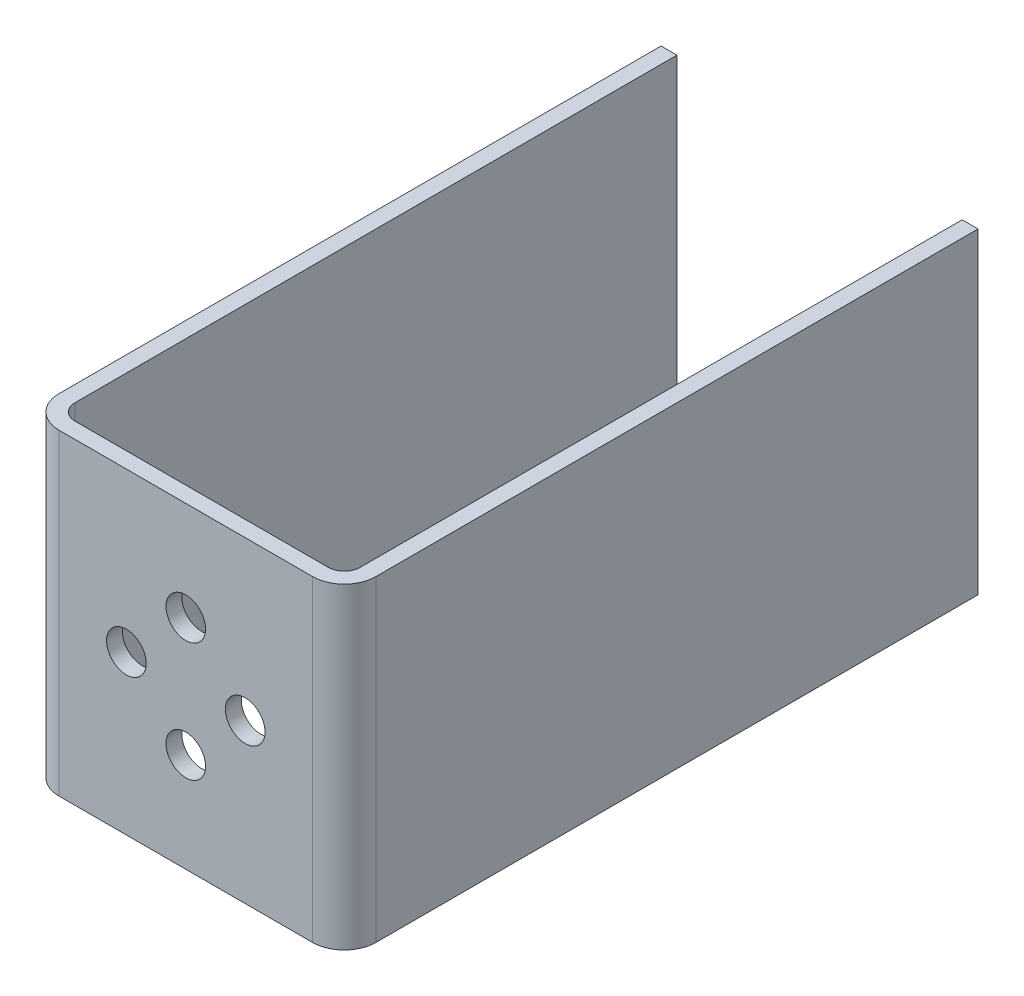
ISO-10303-21;
HEADER;
FILE_DESCRIPTION(('STEP AP214'),'2;1');
FILE_NAME('part.step','',(''),(''),'','','');
FILE_SCHEMA(('AUTOMOTIVE_DESIGN { 1 0 10303 214 1 1 1 1 }'));
ENDSEC;
DATA;
#1=APPLICATION_CONTEXT('core data for automotive mechanical design processes');
#2=APPLICATION_PROTOCOL_DEFINITION('international standard','automotive_design',2000,#1);
#3=PRODUCT_CONTEXT('',#1,'mechanical');
#4=PRODUCT('Part','Part','',(#3));
#5=PRODUCT_RELATED_PRODUCT_CATEGORY('part','',(#4));
#6=PRODUCT_DEFINITION_FORMATION('','',#4);
#7=PRODUCT_DEFINITION_CONTEXT('part definition',#1,'design');
#8=PRODUCT_DEFINITION('design','',#6,#7);
#9=PRODUCT_DEFINITION_SHAPE('','',#8);
#10=(LENGTH_UNIT() NAMED_UNIT(*) SI_UNIT(.MILLI.,.METRE.));
#11=(NAMED_UNIT(*) PLANE_ANGLE_UNIT() SI_UNIT($,.RADIAN.));
#12=(NAMED_UNIT(*) SI_UNIT($,.STERADIAN.) SOLID_ANGLE_UNIT());
#13=UNCERTAINTY_MEASURE_WITH_UNIT(LENGTH_MEASURE(1.E-05),#10,'distance_accuracy_value','');
#14=(GEOMETRIC_REPRESENTATION_CONTEXT(3) GLOBAL_UNCERTAINTY_ASSIGNED_CONTEXT((#13)) GLOBAL_UNIT_ASSIGNED_CONTEXT((#10,
#11,#12)) REPRESENTATION_CONTEXT('',''));
#15=CARTESIAN_POINT('',(0.,0.,0.));
#16=DIRECTION('',(0.,0.,1.));
#17=DIRECTION('',(1.,0.,0.));
#18=AXIS2_PLACEMENT_3D('',#15,#16,#17);
#19=CARTESIAN_POINT('',(48.26,50.8,-101.6));
#20=DIRECTION('',(0.,0.,1.));
#21=DIRECTION('',(1.,0.,0.));
#22=AXIS2_PLACEMENT_3D('',#19,#20,#21);
#23=PLANE('',#22);
#24=DIRECTION('',(-1.,0.,0.));
#25=VECTOR('',#24,1.);
#26=CARTESIAN_POINT('',(48.26,0.,-101.6));
#27=LINE('',#26,#25);
#28=CARTESIAN_POINT('',(50.8,0.,-101.6));
#29=VERTEX_POINT('',#28);
#30=CARTESIAN_POINT('',(48.26,0.,-101.6));
#31=VERTEX_POINT('',#30);
#32=EDGE_CURVE('E158',#29,#31,#27,.T.);
#33=ORIENTED_EDGE('',*,*,#32,.T.);
#34=DIRECTION('',(0.,-1.,0.));
#35=VECTOR('',#34,1.);
#36=CARTESIAN_POINT('',(48.26,50.8,-101.6));
#37=LINE('',#36,#35);
#38=CARTESIAN_POINT('',(48.26,50.8,-101.6));
#39=VERTEX_POINT('',#38);
#40=EDGE_CURVE('E11',#39,#31,#37,.T.);
#41=ORIENTED_EDGE('',*,*,#40,.F.);
#42=DIRECTION('',(-1.,0.,0.));
#43=VECTOR('',#42,1.);
#44=CARTESIAN_POINT('',(48.26,50.8,-101.6));
#45=LINE('',#44,#43);
#46=CARTESIAN_POINT('',(50.8,50.8,-101.6));
#47=VERTEX_POINT('',#46);
#48=EDGE_CURVE('E181',#47,#39,#45,.T.);
#49=ORIENTED_EDGE('',*,*,#48,.F.);
#50=DIRECTION('',(0.,-1.,0.));
#51=VECTOR('',#50,1.);
#52=CARTESIAN_POINT('',(50.8,50.8,-101.6));
#53=LINE('',#52,#51);
#54=EDGE_CURVE('E154',#47,#29,#53,.T.);
#55=ORIENTED_EDGE('',*,*,#54,.T.);
#56=EDGE_LOOP('',(#33,#41,#49,#55));
#57=FACE_BOUND('',#56,.T.);
#58=ADVANCED_FACE('F38',(#57),#23,.F.);
#59=CARTESIAN_POINT('',(48.26,50.8,-5.08));
#60=DIRECTION('',(1.,0.,0.));
#61=DIRECTION('',(0.,0.,-1.));
#62=AXIS2_PLACEMENT_3D('',#59,#60,#61);
#63=PLANE('',#62);
#64=DIRECTION('',(0.,0.,1.));
#65=VECTOR('',#64,1.);
#66=CARTESIAN_POINT('',(48.26,0.,-5.08));
#67=LINE('',#66,#65);
#68=CARTESIAN_POINT('',(48.26,0.,-5.08));
#69=VERTEX_POINT('',#68);
#70=EDGE_CURVE('E161',#31,#69,#67,.T.);
#71=ORIENTED_EDGE('',*,*,#70,.T.);
#72=DIRECTION('',(0.,-1.,0.));
#73=VECTOR('',#72,1.);
#74=CARTESIAN_POINT('',(48.26,50.8,-5.08));
#75=LINE('',#74,#73);
#76=CARTESIAN_POINT('',(48.26,50.8,-5.08));
#77=VERTEX_POINT('',#76);
#78=EDGE_CURVE('E46',#77,#69,#75,.T.);
#79=ORIENTED_EDGE('',*,*,#78,.F.);
#80=DIRECTION('',(0.,0.,1.));
#81=VECTOR('',#80,1.);
#82=CARTESIAN_POINT('',(48.26,50.8,-5.08));
#83=LINE('',#82,#81);
#84=EDGE_CURVE('E109',#39,#77,#83,.T.);
#85=ORIENTED_EDGE('',*,*,#84,.F.);
#86=ORIENTED_EDGE('',*,*,#40,.T.);
#87=EDGE_LOOP('',(#71,#79,#85,#86));
#88=FACE_BOUND('',#87,.T.);
#89=ADVANCED_FACE('F259',(#88),#63,.F.);
#90=CARTESIAN_POINT('',(45.72,50.8,-5.08));
#91=DIRECTION('',(0.,-1.,0.));
#92=DIRECTION('',(0.,0.,-1.));
#93=AXIS2_PLACEMENT_3D('',#90,#91,#92);
#94=CYLINDRICAL_SURFACE('',#93,2.54);
#95=CARTESIAN_POINT('',(45.72,0.,-5.08));
#96=DIRECTION('',(0.,-1.,0.));
#97=DIRECTION('',(0.,0.,1.));
#98=AXIS2_PLACEMENT_3D('',#95,#96,#97);
#99=CIRCLE('',#98,2.54);
#100=CARTESIAN_POINT('',(45.72,0.,-2.54));
#101=VERTEX_POINT('',#100);
#102=EDGE_CURVE('E164',#69,#101,#99,.T.);
#103=ORIENTED_EDGE('',*,*,#102,.T.);
#104=DIRECTION('',(0.,-1.,0.));
#105=VECTOR('',#104,1.);
#106=CARTESIAN_POINT('',(45.72,50.8,-2.54));
#107=LINE('',#106,#105);
#108=CARTESIAN_POINT('',(45.72,50.8,-2.54));
#109=VERTEX_POINT('',#108);
#110=EDGE_CURVE('E200',#109,#101,#107,.T.);
#111=ORIENTED_EDGE('',*,*,#110,.F.);
#112=CARTESIAN_POINT('',(45.72,50.8,-5.08));
#113=DIRECTION('',(0.,-1.,0.));
#114=DIRECTION('',(0.,0.,1.));
#115=AXIS2_PLACEMENT_3D('',#112,#113,#114);
#116=CIRCLE('',#115,2.54);
#117=EDGE_CURVE('E208',#77,#109,#116,.T.);
#118=ORIENTED_EDGE('',*,*,#117,.F.);
#119=ORIENTED_EDGE('',*,*,#78,.T.);
#120=EDGE_LOOP('',(#103,#111,#118,#119));
#121=FACE_BOUND('',#120,.T.);
#122=ADVANCED_FACE('F206',(#121),#94,.F.);
#123=CARTESIAN_POINT('',(5.08000000000001,50.8,-2.54));
#124=DIRECTION('',(0.,0.,1.));
#125=DIRECTION('',(1.,0.,0.));
#126=AXIS2_PLACEMENT_3D('',#123,#124,#125);
#127=PLANE('',#126);
#128=CARTESIAN_POINT('',(34.925,25.4,-2.54));
#129=DIRECTION('',(0.,0.,-1.));
#130=DIRECTION('',(-1.,0.,0.));
#131=AXIS2_PLACEMENT_3D('',#128,#129,#130);
#132=CIRCLE('',#131,3.175);
#133=CARTESIAN_POINT('',(31.75,25.4,-2.54));
#134=VERTEX_POINT('',#133);
#135=EDGE_CURVE('E319',#134,#134,#132,.T.);
#136=ORIENTED_EDGE('',*,*,#135,.F.);
#137=EDGE_LOOP('',(#136));
#138=FACE_BOUND('',#137,.T.);
#139=CARTESIAN_POINT('',(25.4,34.925,-2.54));
#140=DIRECTION('',(0.,0.,-1.));
#141=DIRECTION('',(-1.,0.,0.));
#142=AXIS2_PLACEMENT_3D('',#139,#140,#141);
#143=CIRCLE('',#142,3.175);
#144=CARTESIAN_POINT('',(22.225,34.925,-2.54));
#145=VERTEX_POINT('',#144);
#146=EDGE_CURVE('E316',#145,#145,#143,.T.);
#147=ORIENTED_EDGE('',*,*,#146,.F.);
#148=EDGE_LOOP('',(#147));
#149=FACE_BOUND('',#148,.T.);
#150=CARTESIAN_POINT('',(15.875,25.4,-2.54));
#151=DIRECTION('',(0.,0.,-1.));
#152=DIRECTION('',(-1.,0.,0.));
#153=AXIS2_PLACEMENT_3D('',#150,#151,#152);
#154=CIRCLE('',#153,3.17499999999999);
#155=CARTESIAN_POINT('',(12.7,25.4,-2.54));
#156=VERTEX_POINT('',#155);
#157=EDGE_CURVE('E312',#156,#156,#154,.T.);
#158=ORIENTED_EDGE('',*,*,#157,.F.);
#159=EDGE_LOOP('',(#158));
#160=FACE_BOUND('',#159,.T.);
#161=CARTESIAN_POINT('',(25.4,15.875,-2.54));
#162=DIRECTION('',(0.,0.,-1.));
#163=DIRECTION('',(-1.,0.,0.));
#164=AXIS2_PLACEMENT_3D('',#161,#162,#163);
#165=CIRCLE('',#164,3.175);
#166=CARTESIAN_POINT('',(22.225,15.875,-2.54));
#167=VERTEX_POINT('',#166);
#168=EDGE_CURVE('E304',#167,#167,#165,.T.);
#169=ORIENTED_EDGE('',*,*,#168,.F.);
#170=EDGE_LOOP('',(#169));
#171=FACE_BOUND('',#170,.T.);
#172=DIRECTION('',(-1.,0.,0.));
#173=VECTOR('',#172,1.);
#174=CARTESIAN_POINT('',(5.08000000000001,0.,-2.54));
#175=LINE('',#174,#173);
#176=CARTESIAN_POINT('',(5.08000000000001,0.,-2.54));
#177=VERTEX_POINT('',#176);
#178=EDGE_CURVE('E166',#101,#177,#175,.T.);
#179=ORIENTED_EDGE('',*,*,#178,.T.);
#180=DIRECTION('',(0.,-1.,0.));
#181=VECTOR('',#180,1.);
#182=CARTESIAN_POINT('',(5.08000000000001,50.8,-2.54));
#183=LINE('',#182,#181);
#184=CARTESIAN_POINT('',(5.08000000000001,50.8,-2.54));
#185=VERTEX_POINT('',#184);
#186=EDGE_CURVE('E197',#185,#177,#183,.T.);
#187=ORIENTED_EDGE('',*,*,#186,.F.);
#188=DIRECTION('',(-1.,0.,0.));
#189=VECTOR('',#188,1.);
#190=CARTESIAN_POINT('',(5.08000000000001,50.8,-2.54));
#191=LINE('',#190,#189);
#192=EDGE_CURVE('E226',#109,#185,#191,.T.);
#193=ORIENTED_EDGE('',*,*,#192,.F.);
#194=ORIENTED_EDGE('',*,*,#110,.T.);
#195=EDGE_LOOP('',(#179,#187,#193,#194));
#196=FACE_BOUND('',#195,.T.);
#197=ADVANCED_FACE('F217',(#138,#149,#160,#171,#196),#127,.F.);
#198=CARTESIAN_POINT('',(5.08000000000001,50.8,-5.08));
#199=DIRECTION('',(0.,-1.,0.));
#200=DIRECTION('',(0.,0.,-1.));
#201=AXIS2_PLACEMENT_3D('',#198,#199,#200);
#202=CYLINDRICAL_SURFACE('',#201,2.54);
#203=CARTESIAN_POINT('',(5.08000000000001,0.,-5.08));
#204=DIRECTION('',(0.,-1.,0.));
#205=DIRECTION('',(0.,0.,1.));
#206=AXIS2_PLACEMENT_3D('',#203,#204,#205);
#207=CIRCLE('',#206,2.54);
#208=CARTESIAN_POINT('',(2.54000000000001,0.,-5.08));
#209=VERTEX_POINT('',#208);
#210=EDGE_CURVE('E168',#177,#209,#207,.T.);
#211=ORIENTED_EDGE('',*,*,#210,.T.);
#212=DIRECTION('',(0.,-1.,0.));
#213=VECTOR('',#212,1.);
#214=CARTESIAN_POINT('',(2.54000000000001,50.8,-5.08));
#215=LINE('',#214,#213);
#216=CARTESIAN_POINT('',(2.54000000000001,50.8,-5.08));
#217=VERTEX_POINT('',#216);
#218=EDGE_CURVE('E194',#217,#209,#215,.T.);
#219=ORIENTED_EDGE('',*,*,#218,.F.);
#220=CARTESIAN_POINT('',(5.08000000000001,50.8,-5.08));
#221=DIRECTION('',(0.,-1.,0.));
#222=DIRECTION('',(0.,0.,1.));
#223=AXIS2_PLACEMENT_3D('',#220,#221,#222);
#224=CIRCLE('',#223,2.54);
#225=EDGE_CURVE('E223',#185,#217,#224,.T.);
#226=ORIENTED_EDGE('',*,*,#225,.F.);
#227=ORIENTED_EDGE('',*,*,#186,.T.);
#228=EDGE_LOOP('',(#211,#219,#226,#227));
#229=FACE_BOUND('',#228,.T.);
#230=ADVANCED_FACE('F221',(#229),#202,.F.);
#231=CARTESIAN_POINT('',(2.54,50.8,-101.6));
#232=DIRECTION('',(-1.,0.,0.));
#233=DIRECTION('',(0.,0.,1.));
#234=AXIS2_PLACEMENT_3D('',#231,#232,#233);
#235=PLANE('',#234);
#236=DIRECTION('',(0.,0.,-1.));
#237=VECTOR('',#236,1.);
#238=CARTESIAN_POINT('',(2.54,0.,-101.6));
#239=LINE('',#238,#237);
#240=CARTESIAN_POINT('',(2.54,0.,-101.6));
#241=VERTEX_POINT('',#240);
#242=EDGE_CURVE('E170',#209,#241,#239,.T.);
#243=ORIENTED_EDGE('',*,*,#242,.T.);
#244=DIRECTION('',(0.,-1.,0.));
#245=VECTOR('',#244,1.);
#246=CARTESIAN_POINT('',(2.54,50.8,-101.6));
#247=LINE('',#246,#245);
#248=CARTESIAN_POINT('',(2.54,50.8,-101.6));
#249=VERTEX_POINT('',#248);
#250=EDGE_CURVE('E191',#249,#241,#247,.T.);
#251=ORIENTED_EDGE('',*,*,#250,.F.);
#252=DIRECTION('',(0.,0.,-1.));
#253=VECTOR('',#252,1.);
#254=CARTESIAN_POINT('',(2.54,50.8,-101.6));
#255=LINE('',#254,#253);
#256=EDGE_CURVE('E225',#217,#249,#255,.T.);
#257=ORIENTED_EDGE('',*,*,#256,.F.);
#258=ORIENTED_EDGE('',*,*,#218,.T.);
#259=EDGE_LOOP('',(#243,#251,#257,#258));
#260=FACE_BOUND('',#259,.T.);
#261=ADVANCED_FACE('F273',(#260),#235,.F.);
#262=CARTESIAN_POINT('',(0.,50.8,-101.6));
#263=DIRECTION('',(0.,0.,1.));
#264=DIRECTION('',(1.,0.,0.));
#265=AXIS2_PLACEMENT_3D('',#262,#263,#264);
#266=PLANE('',#265);
#267=DIRECTION('',(-1.,0.,0.));
#268=VECTOR('',#267,1.);
#269=CARTESIAN_POINT('',(0.,0.,-101.6));
#270=LINE('',#269,#268);
#271=CARTESIAN_POINT('',(0.,0.,-101.6));
#272=VERTEX_POINT('',#271);
#273=EDGE_CURVE('E172',#241,#272,#270,.T.);
#274=ORIENTED_EDGE('',*,*,#273,.T.);
#275=DIRECTION('',(0.,-1.,0.));
#276=VECTOR('',#275,1.);
#277=CARTESIAN_POINT('',(0.,50.8,-101.6));
#278=LINE('',#277,#276);
#279=CARTESIAN_POINT('',(0.,50.8,-101.6));
#280=VERTEX_POINT('',#279);
#281=EDGE_CURVE('E188',#280,#272,#278,.T.);
#282=ORIENTED_EDGE('',*,*,#281,.F.);
#283=DIRECTION('',(-1.,0.,0.));
#284=VECTOR('',#283,1.);
#285=CARTESIAN_POINT('',(0.,50.8,-101.6));
#286=LINE('',#285,#284);
#287=EDGE_CURVE('E228',#249,#280,#286,.T.);
#288=ORIENTED_EDGE('',*,*,#287,.F.);
#289=ORIENTED_EDGE('',*,*,#250,.T.);
#290=EDGE_LOOP('',(#274,#282,#288,#289));
#291=FACE_BOUND('',#290,.T.);
#292=ADVANCED_FACE('F276',(#291),#266,.F.);
#293=CARTESIAN_POINT('',(0.,50.8,-5.08000000000004));
#294=DIRECTION('',(1.,0.,0.));
#295=DIRECTION('',(0.,0.,-1.));
#296=AXIS2_PLACEMENT_3D('',#293,#294,#295);
#297=PLANE('',#296);
#298=DIRECTION('',(0.,0.,1.));
#299=VECTOR('',#298,1.);
#300=CARTESIAN_POINT('',(0.,0.,-5.08000000000004));
#301=LINE('',#300,#299);
#302=CARTESIAN_POINT('',(0.,0.,-5.08000000000003));
#303=VERTEX_POINT('',#302);
#304=EDGE_CURVE('E174',#272,#303,#301,.T.);
#305=ORIENTED_EDGE('',*,*,#304,.T.);
#306=DIRECTION('',(0.,-1.,0.));
#307=VECTOR('',#306,1.);
#308=CARTESIAN_POINT('',(0.,50.8,-5.08000000000003));
#309=LINE('',#308,#307);
#310=CARTESIAN_POINT('',(0.,50.8,-5.08000000000003));
#311=VERTEX_POINT('',#310);
#312=EDGE_CURVE('E185',#311,#303,#309,.T.);
#313=ORIENTED_EDGE('',*,*,#312,.F.);
#314=DIRECTION('',(0.,0.,1.));
#315=VECTOR('',#314,1.);
#316=CARTESIAN_POINT('',(0.,50.8,-5.08000000000004));
#317=LINE('',#316,#315);
#318=EDGE_CURVE('E234',#280,#311,#317,.T.);
#319=ORIENTED_EDGE('',*,*,#318,.F.);
#320=ORIENTED_EDGE('',*,*,#281,.T.);
#321=EDGE_LOOP('',(#305,#313,#319,#320));
#322=FACE_BOUND('',#321,.T.);
#323=ADVANCED_FACE('F240',(#322),#297,.F.);
#324=CARTESIAN_POINT('',(5.08,50.8,-5.08));
#325=DIRECTION('',(0.,-1.,0.));
#326=DIRECTION('',(0.,0.,-1.));
#327=AXIS2_PLACEMENT_3D('',#324,#325,#326);
#328=CYLINDRICAL_SURFACE('',#327,5.08);
#329=CARTESIAN_POINT('',(5.08,0.,-5.08));
#330=DIRECTION('',(0.,1.,0.));
#331=DIRECTION('',(0.,0.,-1.));
#332=AXIS2_PLACEMENT_3D('',#329,#330,#331);
#333=CIRCLE('',#332,5.08);
#334=CARTESIAN_POINT('',(5.08000000000004,0.,0.));
#335=VERTEX_POINT('',#334);
#336=EDGE_CURVE('E176',#303,#335,#333,.T.);
#337=ORIENTED_EDGE('',*,*,#336,.T.);
#338=DIRECTION('',(0.,-1.,0.));
#339=VECTOR('',#338,1.);
#340=CARTESIAN_POINT('',(5.08000000000004,50.8,0.));
#341=LINE('',#340,#339);
#342=CARTESIAN_POINT('',(5.08000000000004,50.8,0.));
#343=VERTEX_POINT('',#342);
#344=EDGE_CURVE('E149',#343,#335,#341,.T.);
#345=ORIENTED_EDGE('',*,*,#344,.F.);
#346=CARTESIAN_POINT('',(5.08,50.8,-5.08));
#347=DIRECTION('',(0.,1.,0.));
#348=DIRECTION('',(0.,0.,-1.));
#349=AXIS2_PLACEMENT_3D('',#346,#347,#348);
#350=CIRCLE('',#349,5.08);
#351=EDGE_CURVE('E140',#311,#343,#350,.T.);
#352=ORIENTED_EDGE('',*,*,#351,.F.);
#353=ORIENTED_EDGE('',*,*,#312,.T.);
#354=EDGE_LOOP('',(#337,#345,#352,#353));
#355=FACE_BOUND('',#354,.T.);
#356=ADVANCED_FACE('F244',(#355),#328,.T.);
#357=CARTESIAN_POINT('',(5.08000000000004,50.8,0.));
#358=DIRECTION('',(0.,0.,-1.));
#359=DIRECTION('',(-1.,0.,0.));
#360=AXIS2_PLACEMENT_3D('',#357,#358,#359);
#361=PLANE('',#360);
#362=CARTESIAN_POINT('',(34.925,25.4,0.));
#363=DIRECTION('',(0.,0.,-1.));
#364=DIRECTION('',(-1.,0.,0.));
#365=AXIS2_PLACEMENT_3D('',#362,#363,#364);
#366=CIRCLE('',#365,3.175);
#367=CARTESIAN_POINT('',(31.75,25.4,0.));
#368=VERTEX_POINT('',#367);
#369=EDGE_CURVE('E162',#368,#368,#366,.T.);
#370=ORIENTED_EDGE('',*,*,#369,.T.);
#371=EDGE_LOOP('',(#370));
#372=FACE_BOUND('',#371,.T.);
#373=CARTESIAN_POINT('',(25.4,34.925,0.));
#374=DIRECTION('',(0.,0.,-1.));
#375=DIRECTION('',(-1.,0.,0.));
#376=AXIS2_PLACEMENT_3D('',#373,#374,#375);
#377=CIRCLE('',#376,3.175);
#378=CARTESIAN_POINT('',(22.225,34.925,0.));
#379=VERTEX_POINT('',#378);
#380=EDGE_CURVE('E295',#379,#379,#377,.T.);
#381=ORIENTED_EDGE('',*,*,#380,.T.);
#382=EDGE_LOOP('',(#381));
#383=FACE_BOUND('',#382,.T.);
#384=CARTESIAN_POINT('',(15.875,25.4,0.));
#385=DIRECTION('',(0.,0.,-1.));
#386=DIRECTION('',(-1.,0.,0.));
#387=AXIS2_PLACEMENT_3D('',#384,#385,#386);
#388=CIRCLE('',#387,3.17499999999999);
#389=CARTESIAN_POINT('',(12.7,25.4,0.));
#390=VERTEX_POINT('',#389);
#391=EDGE_CURVE('E299',#390,#390,#388,.T.);
#392=ORIENTED_EDGE('',*,*,#391,.T.);
#393=EDGE_LOOP('',(#392));
#394=FACE_BOUND('',#393,.T.);
#395=CARTESIAN_POINT('',(25.4,15.875,0.));
#396=DIRECTION('',(0.,0.,-1.));
#397=DIRECTION('',(-1.,0.,0.));
#398=AXIS2_PLACEMENT_3D('',#395,#396,#397);
#399=CIRCLE('',#398,3.175);
#400=CARTESIAN_POINT('',(22.225,15.875,0.));
#401=VERTEX_POINT('',#400);
#402=EDGE_CURVE('E302',#401,#401,#399,.T.);
#403=ORIENTED_EDGE('',*,*,#402,.T.);
#404=EDGE_LOOP('',(#403));
#405=FACE_BOUND('',#404,.T.);
#406=DIRECTION('',(1.,0.,0.));
#407=VECTOR('',#406,1.);
#408=CARTESIAN_POINT('',(5.08000000000004,0.,0.));
#409=LINE('',#408,#407);
#410=CARTESIAN_POINT('',(45.72,0.,0.));
#411=VERTEX_POINT('',#410);
#412=EDGE_CURVE('E148',#335,#411,#409,.T.);
#413=ORIENTED_EDGE('',*,*,#412,.T.);
#414=DIRECTION('',(0.,-1.,0.));
#415=VECTOR('',#414,1.);
#416=CARTESIAN_POINT('',(45.72,50.8,0.));
#417=LINE('',#416,#415);
#418=CARTESIAN_POINT('',(45.72,50.8,0.));
#419=VERTEX_POINT('',#418);
#420=EDGE_CURVE('E145',#419,#411,#417,.T.);
#421=ORIENTED_EDGE('',*,*,#420,.F.);
#422=DIRECTION('',(1.,0.,0.));
#423=VECTOR('',#422,1.);
#424=CARTESIAN_POINT('',(5.08000000000004,50.8,0.));
#425=LINE('',#424,#423);
#426=EDGE_CURVE('E134',#343,#419,#425,.T.);
#427=ORIENTED_EDGE('',*,*,#426,.F.);
#428=ORIENTED_EDGE('',*,*,#344,.T.);
#429=EDGE_LOOP('',(#413,#421,#427,#428));
#430=FACE_BOUND('',#429,.T.);
#431=ADVANCED_FACE('F146',(#372,#383,#394,#405,#430),#361,.F.);
#432=CARTESIAN_POINT('',(45.72,50.8,-5.08));
#433=DIRECTION('',(0.,-1.,0.));
#434=DIRECTION('',(0.,0.,-1.));
#435=AXIS2_PLACEMENT_3D('',#432,#433,#434);
#436=CYLINDRICAL_SURFACE('',#435,5.08);
#437=CARTESIAN_POINT('',(45.72,0.,-5.08));
#438=DIRECTION('',(0.,1.,0.));
#439=DIRECTION('',(0.,0.,1.));
#440=AXIS2_PLACEMENT_3D('',#437,#438,#439);
#441=CIRCLE('',#440,5.08);
#442=CARTESIAN_POINT('',(50.8,0.,-5.08));
#443=VERTEX_POINT('',#442);
#444=EDGE_CURVE('E95',#411,#443,#441,.T.);
#445=ORIENTED_EDGE('',*,*,#444,.T.);
#446=DIRECTION('',(0.,-1.,0.));
#447=VECTOR('',#446,1.);
#448=CARTESIAN_POINT('',(50.8,50.8,-5.08));
#449=LINE('',#448,#447);
#450=CARTESIAN_POINT('',(50.8,50.8,-5.08));
#451=VERTEX_POINT('',#450);
#452=EDGE_CURVE('E150',#451,#443,#449,.T.);
#453=ORIENTED_EDGE('',*,*,#452,.F.);
#454=CARTESIAN_POINT('',(45.72,50.8,-5.08));
#455=DIRECTION('',(0.,1.,0.));
#456=DIRECTION('',(0.,0.,1.));
#457=AXIS2_PLACEMENT_3D('',#454,#455,#456);
#458=CIRCLE('',#457,5.08);
#459=EDGE_CURVE('E138',#419,#451,#458,.T.);
#460=ORIENTED_EDGE('',*,*,#459,.F.);
#461=ORIENTED_EDGE('',*,*,#420,.T.);
#462=EDGE_LOOP('',(#445,#453,#460,#461));
#463=FACE_BOUND('',#462,.T.);
#464=ADVANCED_FACE('F152',(#463),#436,.T.);
#465=CARTESIAN_POINT('',(50.8,50.8,-5.08));
#466=DIRECTION('',(-1.,0.,0.));
#467=DIRECTION('',(0.,0.,1.));
#468=AXIS2_PLACEMENT_3D('',#465,#466,#467);
#469=PLANE('',#468);
#470=DIRECTION('',(0.,0.,-1.));
#471=VECTOR('',#470,1.);
#472=CARTESIAN_POINT('',(50.8,0.,-5.08));
#473=LINE('',#472,#471);
#474=EDGE_CURVE('E101',#443,#29,#473,.T.);
#475=ORIENTED_EDGE('',*,*,#474,.T.);
#476=ORIENTED_EDGE('',*,*,#54,.F.);
#477=DIRECTION('',(0.,0.,-1.));
#478=VECTOR('',#477,1.);
#479=CARTESIAN_POINT('',(50.8,50.8,-5.08));
#480=LINE('',#479,#478);
#481=EDGE_CURVE('E54',#451,#47,#480,.T.);
#482=ORIENTED_EDGE('',*,*,#481,.F.);
#483=ORIENTED_EDGE('',*,*,#452,.T.);
#484=EDGE_LOOP('',(#475,#476,#482,#483));
#485=FACE_BOUND('',#484,.T.);
#486=ADVANCED_FACE('F248',(#485),#469,.F.);
#487=CARTESIAN_POINT('',(45.72,50.8,-5.08));
#488=DIRECTION('',(0.,1.,0.));
#489=DIRECTION('',(0.,0.,1.));
#490=AXIS2_PLACEMENT_3D('',#487,#488,#489);
#491=PLANE('',#490);
#492=ORIENTED_EDGE('',*,*,#48,.T.);
#493=ORIENTED_EDGE('',*,*,#84,.T.);
#494=ORIENTED_EDGE('',*,*,#117,.T.);
#495=ORIENTED_EDGE('',*,*,#192,.T.);
#496=ORIENTED_EDGE('',*,*,#225,.T.);
#497=ORIENTED_EDGE('',*,*,#256,.T.);
#498=ORIENTED_EDGE('',*,*,#287,.T.);
#499=ORIENTED_EDGE('',*,*,#318,.T.);
#500=ORIENTED_EDGE('',*,*,#351,.T.);
#501=ORIENTED_EDGE('',*,*,#426,.T.);
#502=ORIENTED_EDGE('',*,*,#459,.T.);
#503=ORIENTED_EDGE('',*,*,#481,.T.);
#504=EDGE_LOOP('',(#492,#493,#494,#495,#496,#497,#498,#499,#500,#501,#502,#503));
#505=FACE_BOUND('',#504,.T.);
#506=ADVANCED_FACE('F136',(#505),#491,.T.);
#507=CARTESIAN_POINT('',(45.72,0.,-5.08));
#508=DIRECTION('',(0.,1.,0.));
#509=DIRECTION('',(0.,0.,1.));
#510=AXIS2_PLACEMENT_3D('',#507,#508,#509);
#511=PLANE('',#510);
#512=ORIENTED_EDGE('',*,*,#32,.F.);
#513=ORIENTED_EDGE('',*,*,#474,.F.);
#514=ORIENTED_EDGE('',*,*,#444,.F.);
#515=ORIENTED_EDGE('',*,*,#412,.F.);
#516=ORIENTED_EDGE('',*,*,#336,.F.);
#517=ORIENTED_EDGE('',*,*,#304,.F.);
#518=ORIENTED_EDGE('',*,*,#273,.F.);
#519=ORIENTED_EDGE('',*,*,#242,.F.);
#520=ORIENTED_EDGE('',*,*,#210,.F.);
#521=ORIENTED_EDGE('',*,*,#178,.F.);
#522=ORIENTED_EDGE('',*,*,#102,.F.);
#523=ORIENTED_EDGE('',*,*,#70,.F.);
#524=EDGE_LOOP('',(#512,#513,#514,#515,#516,#517,#518,#519,#520,#521,#522,#523));
#525=FACE_BOUND('',#524,.T.);
#526=ADVANCED_FACE('F212',(#525),#511,.F.);
#527=CARTESIAN_POINT('',(25.4,15.875,0.));
#528=DIRECTION('',(0.,0.,-1.));
#529=DIRECTION('',(-1.,0.,0.));
#530=AXIS2_PLACEMENT_3D('',#527,#528,#529);
#531=CYLINDRICAL_SURFACE('',#530,3.175);
#532=ORIENTED_EDGE('',*,*,#402,.F.);
#533=EDGE_LOOP('',(#532));
#534=FACE_BOUND('',#533,.T.);
#535=ORIENTED_EDGE('',*,*,#168,.T.);
#536=EDGE_LOOP('',(#535));
#537=FACE_BOUND('',#536,.T.);
#538=ADVANCED_FACE('F332',(#534,#537),#531,.F.);
#539=CARTESIAN_POINT('',(15.875,25.4,0.));
#540=DIRECTION('',(0.,0.,-1.));
#541=DIRECTION('',(-1.,0.,0.));
#542=AXIS2_PLACEMENT_3D('',#539,#540,#541);
#543=CYLINDRICAL_SURFACE('',#542,3.17499999999999);
#544=ORIENTED_EDGE('',*,*,#391,.F.);
#545=EDGE_LOOP('',(#544));
#546=FACE_BOUND('',#545,.T.);
#547=ORIENTED_EDGE('',*,*,#157,.T.);
#548=EDGE_LOOP('',(#547));
#549=FACE_BOUND('',#548,.T.);
#550=ADVANCED_FACE('F334',(#546,#549),#543,.F.);
#551=CARTESIAN_POINT('',(25.4,34.925,0.));
#552=DIRECTION('',(0.,0.,-1.));
#553=DIRECTION('',(-1.,0.,0.));
#554=AXIS2_PLACEMENT_3D('',#551,#552,#553);
#555=CYLINDRICAL_SURFACE('',#554,3.175);
#556=ORIENTED_EDGE('',*,*,#380,.F.);
#557=EDGE_LOOP('',(#556));
#558=FACE_BOUND('',#557,.T.);
#559=ORIENTED_EDGE('',*,*,#146,.T.);
#560=EDGE_LOOP('',(#559));
#561=FACE_BOUND('',#560,.T.);
#562=ADVANCED_FACE('F340',(#558,#561),#555,.F.);
#563=CARTESIAN_POINT('',(34.925,25.4,0.));
#564=DIRECTION('',(0.,0.,-1.));
#565=DIRECTION('',(-1.,0.,0.));
#566=AXIS2_PLACEMENT_3D('',#563,#564,#565);
#567=CYLINDRICAL_SURFACE('',#566,3.175);
#568=ORIENTED_EDGE('',*,*,#369,.F.);
#569=EDGE_LOOP('',(#568));
#570=FACE_BOUND('',#569,.T.);
#571=ORIENTED_EDGE('',*,*,#135,.T.);
#572=EDGE_LOOP('',(#571));
#573=FACE_BOUND('',#572,.T.);
#574=ADVANCED_FACE('F324',(#570,#573),#567,.F.);
#575=CLOSED_SHELL('',(#58,#89,#122,#197,#230,#261,#292,#323,#356,#431,#464,#486,#506,#526,#538,
#550,#562,#574));
#576=MANIFOLD_SOLID_BREP('B2',#575);
#577=ADVANCED_BREP_SHAPE_REPRESENTATION('',(#18,#576),#14);
#578=SHAPE_DEFINITION_REPRESENTATION(#9,#577);
ENDSEC;
END-ISO-10303-21;
